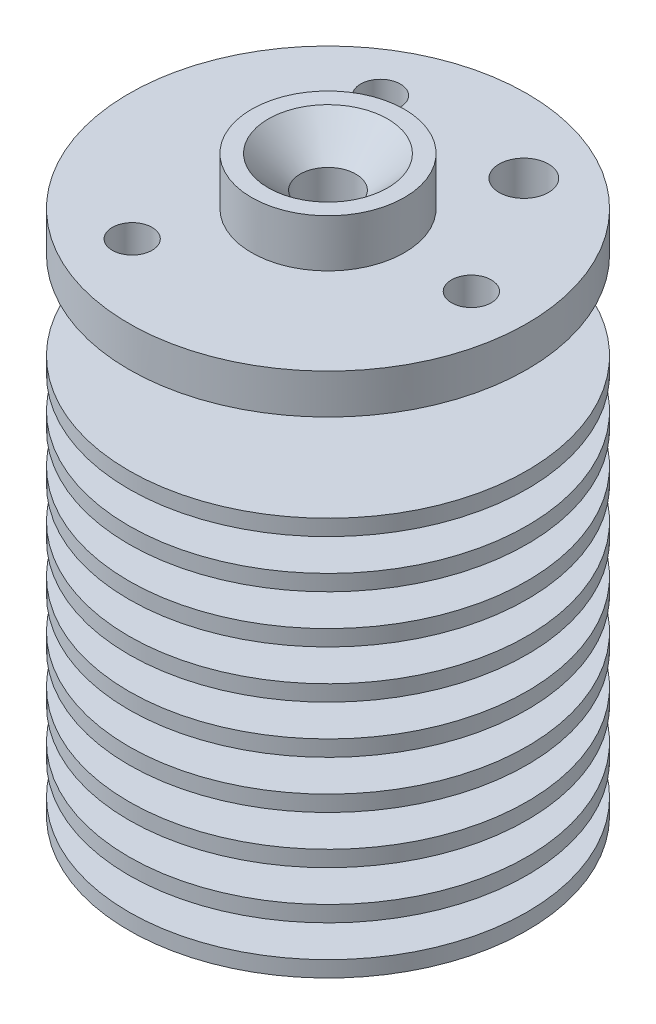
ISO-10303-21;
HEADER;
FILE_DESCRIPTION(('STEP AP214'),'2;1');
FILE_NAME('part.step','',(''),(''),'','','');
FILE_SCHEMA(('AUTOMOTIVE_DESIGN { 1 0 10303 214 1 1 1 1 }'));
ENDSEC;
DATA;
#1=APPLICATION_CONTEXT('core data for automotive mechanical design processes');
#2=APPLICATION_PROTOCOL_DEFINITION('international standard','automotive_design',2000,#1);
#3=PRODUCT_CONTEXT('',#1,'mechanical');
#4=PRODUCT('Part','Part','',(#3));
#5=PRODUCT_RELATED_PRODUCT_CATEGORY('part','',(#4));
#6=PRODUCT_DEFINITION_FORMATION('','',#4);
#7=PRODUCT_DEFINITION_CONTEXT('part definition',#1,'design');
#8=PRODUCT_DEFINITION('design','',#6,#7);
#9=PRODUCT_DEFINITION_SHAPE('','',#8);
#10=(LENGTH_UNIT() NAMED_UNIT(*) SI_UNIT(.MILLI.,.METRE.));
#11=(NAMED_UNIT(*) PLANE_ANGLE_UNIT() SI_UNIT($,.RADIAN.));
#12=(NAMED_UNIT(*) SI_UNIT($,.STERADIAN.) SOLID_ANGLE_UNIT());
#13=UNCERTAINTY_MEASURE_WITH_UNIT(LENGTH_MEASURE(1.E-05),#10,'distance_accuracy_value','');
#14=(GEOMETRIC_REPRESENTATION_CONTEXT(3) GLOBAL_UNCERTAINTY_ASSIGNED_CONTEXT((#13)) GLOBAL_UNIT_ASSIGNED_CONTEXT((#10,
#11,#12)) REPRESENTATION_CONTEXT('',''));
#15=CARTESIAN_POINT('',(0.,0.,0.));
#16=DIRECTION('',(0.,0.,1.));
#17=DIRECTION('',(1.,0.,0.));
#18=AXIS2_PLACEMENT_3D('',#15,#16,#17);
#19=CARTESIAN_POINT('',(0.,9.,-12.5));
#20=DIRECTION('',(0.,-1.,0.));
#21=DIRECTION('',(0.,0.,-1.));
#22=AXIS2_PLACEMENT_3D('',#19,#20,#21);
#23=PLANE('',#22);
#24=CARTESIAN_POINT('',(0.,9.,0.));
#25=DIRECTION('',(0.,1.,0.));
#26=DIRECTION('',(0.,0.,1.));
#27=AXIS2_PLACEMENT_3D('',#24,#25,#26);
#28=CIRCLE('',#27,12.5);
#29=CARTESIAN_POINT('',(0.,9.,12.5));
#30=VERTEX_POINT('',#29);
#31=EDGE_CURVE('E131',#30,#30,#28,.T.);
#32=ORIENTED_EDGE('',*,*,#31,.F.);
#33=EDGE_LOOP('',(#32));
#34=FACE_BOUND('',#33,.T.);
#35=CARTESIAN_POINT('',(0.,9.,0.));
#36=DIRECTION('',(0.,-1.,0.));
#37=DIRECTION('',(0.,0.,-1.));
#38=AXIS2_PLACEMENT_3D('',#35,#36,#37);
#39=CIRCLE('',#38,5.);
#40=CARTESIAN_POINT('',(0.,9.,-5.));
#41=VERTEX_POINT('',#40);
#42=EDGE_CURVE('E192',#41,#41,#39,.T.);
#43=ORIENTED_EDGE('',*,*,#42,.F.);
#44=EDGE_LOOP('',(#43));
#45=FACE_BOUND('',#44,.T.);
#46=ADVANCED_FACE('F36',(#34,#45),#23,.T.);
#47=CARTESIAN_POINT('',(0.,0.999999999999997,-3.5));
#48=DIRECTION('',(0.,1.,0.));
#49=DIRECTION('',(0.,0.,1.));
#50=AXIS2_PLACEMENT_3D('',#47,#48,#49);
#51=PLANE('',#50);
#52=CARTESIAN_POINT('',(0.,0.999999999999994,0.));
#53=DIRECTION('',(0.,1.,0.));
#54=DIRECTION('',(0.,0.,1.));
#55=AXIS2_PLACEMENT_3D('',#52,#53,#54);
#56=CIRCLE('',#55,12.5);
#57=CARTESIAN_POINT('',(0.,0.999999999999994,12.5));
#58=VERTEX_POINT('',#57);
#59=EDGE_CURVE('E146',#58,#58,#56,.T.);
#60=ORIENTED_EDGE('',*,*,#59,.T.);
#61=EDGE_LOOP('',(#60));
#62=FACE_BOUND('',#61,.T.);
#63=CARTESIAN_POINT('',(0.,0.999999999999997,0.));
#64=DIRECTION('',(0.,1.,0.));
#65=DIRECTION('',(0.,0.,1.));
#66=AXIS2_PLACEMENT_3D('',#63,#64,#65);
#67=CIRCLE('',#66,5.);
#68=CARTESIAN_POINT('',(0.,0.999999999999997,5.));
#69=VERTEX_POINT('',#68);
#70=EDGE_CURVE('E191',#69,#69,#67,.T.);
#71=ORIENTED_EDGE('',*,*,#70,.F.);
#72=EDGE_LOOP('',(#71));
#73=FACE_BOUND('',#72,.T.);
#74=ADVANCED_FACE('F239',(#62,#73),#51,.T.);
#75=CARTESIAN_POINT('',(-0.8,33.,0.));
#76=DIRECTION('',(0.,-1.,0.));
#77=DIRECTION('',(0.,0.,-1.));
#78=AXIS2_PLACEMENT_3D('',#75,#76,#77);
#79=PLANE('',#78);
#80=CARTESIAN_POINT('',(4.49999999999998,33.,-7.79422863405996));
#81=DIRECTION('',(0.,1.,0.));
#82=DIRECTION('',(0.,0.,1.));
#83=AXIS2_PLACEMENT_3D('',#80,#81,#82);
#84=CIRCLE('',#83,1.55);
#85=CARTESIAN_POINT('',(4.49999999999998,33.,-6.24422863405996));
#86=VERTEX_POINT('',#85);
#87=EDGE_CURVE('E195',#86,#86,#84,.T.);
#88=ORIENTED_EDGE('',*,*,#87,.F.);
#89=EDGE_LOOP('',(#88));
#90=FACE_BOUND('',#89,.T.);
#91=CARTESIAN_POINT('',(-4.5,33.,-7.79422863405995));
#92=DIRECTION('',(0.,1.,0.));
#93=DIRECTION('',(0.,0.,1.));
#94=AXIS2_PLACEMENT_3D('',#91,#92,#93);
#95=CIRCLE('',#94,1.25);
#96=CARTESIAN_POINT('',(-4.5,33.,-6.54422863405995));
#97=VERTEX_POINT('',#96);
#98=EDGE_CURVE('E173',#97,#97,#95,.T.);
#99=ORIENTED_EDGE('',*,*,#98,.F.);
#100=EDGE_LOOP('',(#99));
#101=FACE_BOUND('',#100,.T.);
#102=CARTESIAN_POINT('',(-4.5,33.,7.79422863405995));
#103=DIRECTION('',(0.,1.,0.));
#104=DIRECTION('',(0.,0.,1.));
#105=AXIS2_PLACEMENT_3D('',#102,#103,#104);
#106=CIRCLE('',#105,1.25);
#107=CARTESIAN_POINT('',(-4.5,33.,9.04422863405995));
#108=VERTEX_POINT('',#107);
#109=EDGE_CURVE('E167',#108,#108,#106,.T.);
#110=ORIENTED_EDGE('',*,*,#109,.F.);
#111=EDGE_LOOP('',(#110));
#112=FACE_BOUND('',#111,.T.);
#113=CARTESIAN_POINT('',(9.,33.,0.));
#114=DIRECTION('',(0.,1.,0.));
#115=DIRECTION('',(0.,0.,1.));
#116=AXIS2_PLACEMENT_3D('',#113,#114,#115);
#117=CIRCLE('',#116,1.25);
#118=CARTESIAN_POINT('',(9.,33.,1.25));
#119=VERTEX_POINT('',#118);
#120=EDGE_CURVE('E161',#119,#119,#117,.T.);
#121=ORIENTED_EDGE('',*,*,#120,.F.);
#122=EDGE_LOOP('',(#121));
#123=FACE_BOUND('',#122,.T.);
#124=CARTESIAN_POINT('',(0.,33.,0.));
#125=DIRECTION('',(0.,-1.,0.));
#126=DIRECTION('',(0.,0.,-1.));
#127=AXIS2_PLACEMENT_3D('',#124,#125,#126);
#128=CIRCLE('',#127,12.5);
#129=CARTESIAN_POINT('',(0.,33.,-12.5));
#130=VERTEX_POINT('',#129);
#131=EDGE_CURVE('E59',#130,#130,#128,.T.);
#132=ORIENTED_EDGE('',*,*,#131,.F.);
#133=EDGE_LOOP('',(#132));
#134=FACE_BOUND('',#133,.T.);
#135=CARTESIAN_POINT('',(0.,33.,0.));
#136=DIRECTION('',(0.,-1.,0.));
#137=DIRECTION('',(0.,0.,-1.));
#138=AXIS2_PLACEMENT_3D('',#135,#136,#137);
#139=CIRCLE('',#138,4.8);
#140=CARTESIAN_POINT('',(0.,33.,-4.8));
#141=VERTEX_POINT('',#140);
#142=EDGE_CURVE('E47',#141,#141,#139,.F.);
#143=ORIENTED_EDGE('',*,*,#142,.F.);
#144=EDGE_LOOP('',(#143));
#145=FACE_BOUND('',#144,.T.);
#146=ADVANCED_FACE('F245',(#90,#101,#112,#123,#134,#145),#79,.F.);
#147=CARTESIAN_POINT('',(0.,0.,0.));
#148=DIRECTION('',(0.,-1.,0.));
#149=DIRECTION('',(0.,0.,-1.));
#150=AXIS2_PLACEMENT_3D('',#147,#148,#149);
#151=CYLINDRICAL_SURFACE('',#150,12.5);
#152=CARTESIAN_POINT('',(0.,0.,0.));
#153=DIRECTION('',(0.,-1.,0.));
#154=DIRECTION('',(0.,0.,-1.));
#155=AXIS2_PLACEMENT_3D('',#152,#153,#154);
#156=CIRCLE('',#155,12.5);
#157=CARTESIAN_POINT('',(0.,0.,-12.5));
#158=VERTEX_POINT('',#157);
#159=EDGE_CURVE('E62',#158,#158,#156,.T.);
#160=ORIENTED_EDGE('',*,*,#159,.F.);
#161=EDGE_LOOP('',(#160));
#162=FACE_BOUND('',#161,.T.);
#163=ORIENTED_EDGE('',*,*,#59,.F.);
#164=EDGE_LOOP('',(#163));
#165=FACE_BOUND('',#164,.T.);
#166=ADVANCED_FACE('F336',(#162,#165),#151,.T.);
#167=CARTESIAN_POINT('',(0.,9.99999999999999,0.));
#168=DIRECTION('',(0.,1.,0.));
#169=DIRECTION('',(0.,0.,1.));
#170=AXIS2_PLACEMENT_3D('',#167,#168,#169);
#171=CIRCLE('',#170,12.5);
#172=CARTESIAN_POINT('',(0.,9.99999999999999,12.5));
#173=VERTEX_POINT('',#172);
#174=EDGE_CURVE('E128',#173,#173,#171,.T.);
#175=ORIENTED_EDGE('',*,*,#174,.F.);
#176=EDGE_LOOP('',(#175));
#177=FACE_BOUND('',#176,.T.);
#178=ORIENTED_EDGE('',*,*,#31,.T.);
#179=EDGE_LOOP('',(#178));
#180=FACE_BOUND('',#179,.T.);
#181=ADVANCED_FACE('F352',(#177,#180),#151,.T.);
#182=CARTESIAN_POINT('',(0.,13.,0.));
#183=DIRECTION('',(0.,1.,0.));
#184=DIRECTION('',(0.,0.,1.));
#185=AXIS2_PLACEMENT_3D('',#182,#183,#184);
#186=CIRCLE('',#185,12.5);
#187=CARTESIAN_POINT('',(0.,13.,12.5));
#188=VERTEX_POINT('',#187);
#189=EDGE_CURVE('E116',#188,#188,#186,.T.);
#190=ORIENTED_EDGE('',*,*,#189,.F.);
#191=EDGE_LOOP('',(#190));
#192=FACE_BOUND('',#191,.T.);
#193=CARTESIAN_POINT('',(0.,12.,0.));
#194=DIRECTION('',(0.,1.,0.));
#195=DIRECTION('',(0.,0.,1.));
#196=AXIS2_PLACEMENT_3D('',#193,#194,#195);
#197=CIRCLE('',#196,12.5);
#198=CARTESIAN_POINT('',(0.,12.,12.5));
#199=VERTEX_POINT('',#198);
#200=EDGE_CURVE('E119',#199,#199,#197,.T.);
#201=ORIENTED_EDGE('',*,*,#200,.T.);
#202=EDGE_LOOP('',(#201));
#203=FACE_BOUND('',#202,.T.);
#204=ADVANCED_FACE('F575',(#192,#203),#151,.T.);
#205=CARTESIAN_POINT('',(0.,16.,0.));
#206=DIRECTION('',(0.,1.,0.));
#207=DIRECTION('',(0.,0.,1.));
#208=AXIS2_PLACEMENT_3D('',#205,#206,#207);
#209=CIRCLE('',#208,12.5);
#210=CARTESIAN_POINT('',(0.,16.,12.5));
#211=VERTEX_POINT('',#210);
#212=EDGE_CURVE('E104',#211,#211,#209,.T.);
#213=ORIENTED_EDGE('',*,*,#212,.F.);
#214=EDGE_LOOP('',(#213));
#215=FACE_BOUND('',#214,.T.);
#216=CARTESIAN_POINT('',(0.,15.,0.));
#217=DIRECTION('',(0.,1.,0.));
#218=DIRECTION('',(0.,0.,1.));
#219=AXIS2_PLACEMENT_3D('',#216,#217,#218);
#220=CIRCLE('',#219,12.5);
#221=CARTESIAN_POINT('',(0.,15.,12.5));
#222=VERTEX_POINT('',#221);
#223=EDGE_CURVE('E107',#222,#222,#220,.T.);
#224=ORIENTED_EDGE('',*,*,#223,.T.);
#225=EDGE_LOOP('',(#224));
#226=FACE_BOUND('',#225,.T.);
#227=ADVANCED_FACE('F582',(#215,#226),#151,.T.);
#228=CARTESIAN_POINT('',(0.,19.,0.));
#229=DIRECTION('',(0.,1.,0.));
#230=DIRECTION('',(0.,0.,1.));
#231=AXIS2_PLACEMENT_3D('',#228,#229,#230);
#232=CIRCLE('',#231,12.5);
#233=CARTESIAN_POINT('',(0.,19.,12.5));
#234=VERTEX_POINT('',#233);
#235=EDGE_CURVE('E92',#234,#234,#232,.T.);
#236=ORIENTED_EDGE('',*,*,#235,.F.);
#237=EDGE_LOOP('',(#236));
#238=FACE_BOUND('',#237,.T.);
#239=CARTESIAN_POINT('',(0.,18.,0.));
#240=DIRECTION('',(0.,1.,0.));
#241=DIRECTION('',(0.,0.,1.));
#242=AXIS2_PLACEMENT_3D('',#239,#240,#241);
#243=CIRCLE('',#242,12.5);
#244=CARTESIAN_POINT('',(0.,18.,12.5));
#245=VERTEX_POINT('',#244);
#246=EDGE_CURVE('E95',#245,#245,#243,.T.);
#247=ORIENTED_EDGE('',*,*,#246,.T.);
#248=EDGE_LOOP('',(#247));
#249=FACE_BOUND('',#248,.T.);
#250=ADVANCED_FACE('F331',(#238,#249),#151,.T.);
#251=CARTESIAN_POINT('',(0.,22.,0.));
#252=DIRECTION('',(0.,1.,0.));
#253=DIRECTION('',(0.,0.,1.));
#254=AXIS2_PLACEMENT_3D('',#251,#252,#253);
#255=CIRCLE('',#254,12.5);
#256=CARTESIAN_POINT('',(0.,22.,12.5));
#257=VERTEX_POINT('',#256);
#258=EDGE_CURVE('E80',#257,#257,#255,.T.);
#259=ORIENTED_EDGE('',*,*,#258,.F.);
#260=EDGE_LOOP('',(#259));
#261=FACE_BOUND('',#260,.T.);
#262=CARTESIAN_POINT('',(0.,21.,0.));
#263=DIRECTION('',(0.,1.,0.));
#264=DIRECTION('',(0.,0.,1.));
#265=AXIS2_PLACEMENT_3D('',#262,#263,#264);
#266=CIRCLE('',#265,12.5);
#267=CARTESIAN_POINT('',(0.,21.,12.5));
#268=VERTEX_POINT('',#267);
#269=EDGE_CURVE('E83',#268,#268,#266,.T.);
#270=ORIENTED_EDGE('',*,*,#269,.T.);
#271=EDGE_LOOP('',(#270));
#272=FACE_BOUND('',#271,.T.);
#273=ADVANCED_FACE('F322',(#261,#272),#151,.T.);
#274=CARTESIAN_POINT('',(0.,25.,0.));
#275=DIRECTION('',(0.,1.,0.));
#276=DIRECTION('',(0.,0.,1.));
#277=AXIS2_PLACEMENT_3D('',#274,#275,#276);
#278=CIRCLE('',#277,12.5);
#279=CARTESIAN_POINT('',(0.,25.,12.5));
#280=VERTEX_POINT('',#279);
#281=EDGE_CURVE('E68',#280,#280,#278,.T.);
#282=ORIENTED_EDGE('',*,*,#281,.F.);
#283=EDGE_LOOP('',(#282));
#284=FACE_BOUND('',#283,.T.);
#285=CARTESIAN_POINT('',(0.,24.,0.));
#286=DIRECTION('',(0.,1.,0.));
#287=DIRECTION('',(0.,0.,1.));
#288=AXIS2_PLACEMENT_3D('',#285,#286,#287);
#289=CIRCLE('',#288,12.5);
#290=CARTESIAN_POINT('',(0.,24.,12.5));
#291=VERTEX_POINT('',#290);
#292=EDGE_CURVE('E71',#291,#291,#289,.T.);
#293=ORIENTED_EDGE('',*,*,#292,.T.);
#294=EDGE_LOOP('',(#293));
#295=FACE_BOUND('',#294,.T.);
#296=ADVANCED_FACE('F319',(#284,#295),#151,.T.);
#297=CARTESIAN_POINT('',(0.,30.5,0.));
#298=DIRECTION('',(0.,1.,0.));
#299=DIRECTION('',(0.,0.,1.));
#300=AXIS2_PLACEMENT_3D('',#297,#298,#299);
#301=CIRCLE('',#300,12.5);
#302=CARTESIAN_POINT('',(0.,30.5,12.5));
#303=VERTEX_POINT('',#302);
#304=EDGE_CURVE('E155',#303,#303,#301,.T.);
#305=ORIENTED_EDGE('',*,*,#304,.T.);
#306=EDGE_LOOP('',(#305));
#307=FACE_BOUND('',#306,.T.);
#308=ORIENTED_EDGE('',*,*,#131,.T.);
#309=EDGE_LOOP('',(#308));
#310=FACE_BOUND('',#309,.T.);
#311=ADVANCED_FACE('F321',(#307,#310),#151,.T.);
#312=CARTESIAN_POINT('',(-12.5,0.,0.));
#313=DIRECTION('',(0.,1.,0.));
#314=DIRECTION('',(0.,0.,1.));
#315=AXIS2_PLACEMENT_3D('',#312,#313,#314);
#316=PLANE('',#315);
#317=ORIENTED_EDGE('',*,*,#159,.T.);
#318=EDGE_LOOP('',(#317));
#319=FACE_BOUND('',#318,.T.);
#320=CARTESIAN_POINT('',(0.,0.,0.));
#321=DIRECTION('',(0.,-1.,0.));
#322=DIRECTION('',(0.,0.,-1.));
#323=AXIS2_PLACEMENT_3D('',#320,#321,#322);
#324=CIRCLE('',#323,2.5);
#325=CARTESIAN_POINT('',(0.,0.,-2.5));
#326=VERTEX_POINT('',#325);
#327=EDGE_CURVE('E51',#326,#326,#324,.T.);
#328=ORIENTED_EDGE('',*,*,#327,.F.);
#329=EDGE_LOOP('',(#328));
#330=FACE_BOUND('',#329,.T.);
#331=ADVANCED_FACE('F328',(#319,#330),#316,.F.);
#332=CARTESIAN_POINT('',(0.,0.,0.));
#333=DIRECTION('',(0.,-1.,0.));
#334=DIRECTION('',(0.,0.,-1.));
#335=AXIS2_PLACEMENT_3D('',#332,#333,#334);
#336=CYLINDRICAL_SURFACE('',#335,2.5);
#337=CARTESIAN_POINT('',(0.,6.,0.));
#338=DIRECTION('',(0.,-1.,0.));
#339=DIRECTION('',(0.,0.,-1.));
#340=AXIS2_PLACEMENT_3D('',#337,#338,#339);
#341=CIRCLE('',#340,2.5);
#342=CARTESIAN_POINT('',(0.,6.,-2.5));
#343=VERTEX_POINT('',#342);
#344=EDGE_CURVE('E56',#343,#343,#341,.T.);
#345=ORIENTED_EDGE('',*,*,#344,.F.);
#346=EDGE_LOOP('',(#345));
#347=FACE_BOUND('',#346,.T.);
#348=ORIENTED_EDGE('',*,*,#327,.T.);
#349=EDGE_LOOP('',(#348));
#350=FACE_BOUND('',#349,.T.);
#351=ADVANCED_FACE('F234',(#347,#350),#336,.F.);
#352=CARTESIAN_POINT('',(-2.5,6.,0.));
#353=DIRECTION('',(0.,1.,0.));
#354=DIRECTION('',(0.,0.,1.));
#355=AXIS2_PLACEMENT_3D('',#352,#353,#354);
#356=PLANE('',#355);
#357=CARTESIAN_POINT('',(0.,6.,0.));
#358=DIRECTION('',(0.,1.,0.));
#359=DIRECTION('',(0.,0.,1.));
#360=AXIS2_PLACEMENT_3D('',#357,#358,#359);
#361=CIRCLE('',#360,1.75);
#362=CARTESIAN_POINT('',(0.,6.,1.75));
#363=VERTEX_POINT('',#362);
#364=EDGE_CURVE('E152',#363,#363,#361,.T.);
#365=ORIENTED_EDGE('',*,*,#364,.T.);
#366=EDGE_LOOP('',(#365));
#367=FACE_BOUND('',#366,.T.);
#368=ORIENTED_EDGE('',*,*,#344,.T.);
#369=EDGE_LOOP('',(#368));
#370=FACE_BOUND('',#369,.T.);
#371=ADVANCED_FACE('F224',(#367,#370),#356,.F.);
#372=CARTESIAN_POINT('',(0.,33.,0.));
#373=DIRECTION('',(0.,1.,0.));
#374=DIRECTION('',(0.,0.,1.));
#375=AXIS2_PLACEMENT_3D('',#372,#373,#374);
#376=CYLINDRICAL_SURFACE('',#375,3.5);
#377=CARTESIAN_POINT('',(0.,25.,0.));
#378=DIRECTION('',(0.,1.,0.));
#379=DIRECTION('',(0.,0.,1.));
#380=AXIS2_PLACEMENT_3D('',#377,#378,#379);
#381=CIRCLE('',#380,3.5);
#382=CARTESIAN_POINT('',(0.,25.,3.5));
#383=VERTEX_POINT('',#382);
#384=EDGE_CURVE('E65',#383,#383,#381,.T.);
#385=ORIENTED_EDGE('',*,*,#384,.T.);
#386=EDGE_LOOP('',(#385));
#387=FACE_BOUND('',#386,.T.);
#388=CARTESIAN_POINT('',(0.,30.5,0.));
#389=DIRECTION('',(0.,1.,0.));
#390=DIRECTION('',(0.,0.,1.));
#391=AXIS2_PLACEMENT_3D('',#388,#389,#390);
#392=CIRCLE('',#391,3.5);
#393=CARTESIAN_POINT('',(0.,30.5,3.5));
#394=VERTEX_POINT('',#393);
#395=EDGE_CURVE('E158',#394,#394,#392,.T.);
#396=ORIENTED_EDGE('',*,*,#395,.F.);
#397=EDGE_LOOP('',(#396));
#398=FACE_BOUND('',#397,.T.);
#399=ADVANCED_FACE('F221',(#387,#398),#376,.T.);
#400=CARTESIAN_POINT('',(0.,25.,-3.5));
#401=DIRECTION('',(0.,1.,0.));
#402=DIRECTION('',(0.,0.,1.));
#403=AXIS2_PLACEMENT_3D('',#400,#401,#402);
#404=PLANE('',#403);
#405=ORIENTED_EDGE('',*,*,#281,.T.);
#406=EDGE_LOOP('',(#405));
#407=FACE_BOUND('',#406,.T.);
#408=ORIENTED_EDGE('',*,*,#384,.F.);
#409=EDGE_LOOP('',(#408));
#410=FACE_BOUND('',#409,.T.);
#411=ADVANCED_FACE('F223',(#407,#410),#404,.T.);
#412=CARTESIAN_POINT('',(0.,24.,-12.5));
#413=DIRECTION('',(0.,-1.,0.));
#414=DIRECTION('',(0.,0.,-1.));
#415=AXIS2_PLACEMENT_3D('',#412,#413,#414);
#416=PLANE('',#415);
#417=CARTESIAN_POINT('',(0.,24.,0.));
#418=DIRECTION('',(0.,1.,0.));
#419=DIRECTION('',(0.,0.,1.));
#420=AXIS2_PLACEMENT_3D('',#417,#418,#419);
#421=CIRCLE('',#420,3.5);
#422=CARTESIAN_POINT('',(0.,24.,3.5));
#423=VERTEX_POINT('',#422);
#424=EDGE_CURVE('E74',#423,#423,#421,.T.);
#425=ORIENTED_EDGE('',*,*,#424,.T.);
#426=EDGE_LOOP('',(#425));
#427=FACE_BOUND('',#426,.T.);
#428=ORIENTED_EDGE('',*,*,#292,.F.);
#429=EDGE_LOOP('',(#428));
#430=FACE_BOUND('',#429,.T.);
#431=ADVANCED_FACE('F231',(#427,#430),#416,.T.);
#432=CARTESIAN_POINT('',(0.,27.,0.));
#433=DIRECTION('',(0.,1.,0.));
#434=DIRECTION('',(0.,0.,1.));
#435=AXIS2_PLACEMENT_3D('',#432,#433,#434);
#436=CYLINDRICAL_SURFACE('',#435,3.5);
#437=CARTESIAN_POINT('',(0.,22.,0.));
#438=DIRECTION('',(0.,1.,0.));
#439=DIRECTION('',(0.,0.,1.));
#440=AXIS2_PLACEMENT_3D('',#437,#438,#439);
#441=CIRCLE('',#440,3.5);
#442=CARTESIAN_POINT('',(0.,22.,3.5));
#443=VERTEX_POINT('',#442);
#444=EDGE_CURVE('E77',#443,#443,#441,.T.);
#445=ORIENTED_EDGE('',*,*,#444,.T.);
#446=EDGE_LOOP('',(#445));
#447=FACE_BOUND('',#446,.T.);
#448=ORIENTED_EDGE('',*,*,#424,.F.);
#449=EDGE_LOOP('',(#448));
#450=FACE_BOUND('',#449,.T.);
#451=ADVANCED_FACE('F306',(#447,#450),#436,.T.);
#452=CARTESIAN_POINT('',(0.,22.,-3.5));
#453=DIRECTION('',(0.,1.,0.));
#454=DIRECTION('',(0.,0.,1.));
#455=AXIS2_PLACEMENT_3D('',#452,#453,#454);
#456=PLANE('',#455);
#457=ORIENTED_EDGE('',*,*,#258,.T.);
#458=EDGE_LOOP('',(#457));
#459=FACE_BOUND('',#458,.T.);
#460=ORIENTED_EDGE('',*,*,#444,.F.);
#461=EDGE_LOOP('',(#460));
#462=FACE_BOUND('',#461,.T.);
#463=ADVANCED_FACE('F302',(#459,#462),#456,.T.);
#464=CARTESIAN_POINT('',(0.,21.,-12.5));
#465=DIRECTION('',(0.,-1.,0.));
#466=DIRECTION('',(0.,0.,-1.));
#467=AXIS2_PLACEMENT_3D('',#464,#465,#466);
#468=PLANE('',#467);
#469=CARTESIAN_POINT('',(0.,21.,0.));
#470=DIRECTION('',(0.,1.,0.));
#471=DIRECTION('',(0.,0.,1.));
#472=AXIS2_PLACEMENT_3D('',#469,#470,#471);
#473=CIRCLE('',#472,3.5);
#474=CARTESIAN_POINT('',(0.,21.,3.5));
#475=VERTEX_POINT('',#474);
#476=EDGE_CURVE('E86',#475,#475,#473,.T.);
#477=ORIENTED_EDGE('',*,*,#476,.T.);
#478=EDGE_LOOP('',(#477));
#479=FACE_BOUND('',#478,.T.);
#480=ORIENTED_EDGE('',*,*,#269,.F.);
#481=EDGE_LOOP('',(#480));
#482=FACE_BOUND('',#481,.T.);
#483=ADVANCED_FACE('F298',(#479,#482),#468,.T.);
#484=CARTESIAN_POINT('',(0.,24.,0.));
#485=DIRECTION('',(0.,1.,0.));
#486=DIRECTION('',(0.,0.,1.));
#487=AXIS2_PLACEMENT_3D('',#484,#485,#486);
#488=CYLINDRICAL_SURFACE('',#487,3.5);
#489=CARTESIAN_POINT('',(0.,19.,0.));
#490=DIRECTION('',(0.,1.,0.));
#491=DIRECTION('',(0.,0.,1.));
#492=AXIS2_PLACEMENT_3D('',#489,#490,#491);
#493=CIRCLE('',#492,3.5);
#494=CARTESIAN_POINT('',(0.,19.,3.5));
#495=VERTEX_POINT('',#494);
#496=EDGE_CURVE('E89',#495,#495,#493,.T.);
#497=ORIENTED_EDGE('',*,*,#496,.T.);
#498=EDGE_LOOP('',(#497));
#499=FACE_BOUND('',#498,.T.);
#500=ORIENTED_EDGE('',*,*,#476,.F.);
#501=EDGE_LOOP('',(#500));
#502=FACE_BOUND('',#501,.T.);
#503=ADVANCED_FACE('F294',(#499,#502),#488,.T.);
#504=CARTESIAN_POINT('',(0.,19.,-3.5));
#505=DIRECTION('',(0.,1.,0.));
#506=DIRECTION('',(0.,0.,1.));
#507=AXIS2_PLACEMENT_3D('',#504,#505,#506);
#508=PLANE('',#507);
#509=ORIENTED_EDGE('',*,*,#235,.T.);
#510=EDGE_LOOP('',(#509));
#511=FACE_BOUND('',#510,.T.);
#512=ORIENTED_EDGE('',*,*,#496,.F.);
#513=EDGE_LOOP('',(#512));
#514=FACE_BOUND('',#513,.T.);
#515=ADVANCED_FACE('F290',(#511,#514),#508,.T.);
#516=CARTESIAN_POINT('',(0.,18.,-12.5));
#517=DIRECTION('',(0.,-1.,0.));
#518=DIRECTION('',(0.,0.,-1.));
#519=AXIS2_PLACEMENT_3D('',#516,#517,#518);
#520=PLANE('',#519);
#521=CARTESIAN_POINT('',(0.,18.,0.));
#522=DIRECTION('',(0.,1.,0.));
#523=DIRECTION('',(0.,0.,1.));
#524=AXIS2_PLACEMENT_3D('',#521,#522,#523);
#525=CIRCLE('',#524,3.5);
#526=CARTESIAN_POINT('',(0.,18.,3.5));
#527=VERTEX_POINT('',#526);
#528=EDGE_CURVE('E98',#527,#527,#525,.T.);
#529=ORIENTED_EDGE('',*,*,#528,.T.);
#530=EDGE_LOOP('',(#529));
#531=FACE_BOUND('',#530,.T.);
#532=ORIENTED_EDGE('',*,*,#246,.F.);
#533=EDGE_LOOP('',(#532));
#534=FACE_BOUND('',#533,.T.);
#535=ADVANCED_FACE('F286',(#531,#534),#520,.T.);
#536=CARTESIAN_POINT('',(0.,21.,0.));
#537=DIRECTION('',(0.,1.,0.));
#538=DIRECTION('',(0.,0.,1.));
#539=AXIS2_PLACEMENT_3D('',#536,#537,#538);
#540=CYLINDRICAL_SURFACE('',#539,3.5);
#541=CARTESIAN_POINT('',(0.,16.,0.));
#542=DIRECTION('',(0.,1.,0.));
#543=DIRECTION('',(0.,0.,1.));
#544=AXIS2_PLACEMENT_3D('',#541,#542,#543);
#545=CIRCLE('',#544,3.5);
#546=CARTESIAN_POINT('',(0.,16.,3.5));
#547=VERTEX_POINT('',#546);
#548=EDGE_CURVE('E101',#547,#547,#545,.T.);
#549=ORIENTED_EDGE('',*,*,#548,.T.);
#550=EDGE_LOOP('',(#549));
#551=FACE_BOUND('',#550,.T.);
#552=ORIENTED_EDGE('',*,*,#528,.F.);
#553=EDGE_LOOP('',(#552));
#554=FACE_BOUND('',#553,.T.);
#555=ADVANCED_FACE('F282',(#551,#554),#540,.T.);
#556=CARTESIAN_POINT('',(0.,16.,-3.5));
#557=DIRECTION('',(0.,1.,0.));
#558=DIRECTION('',(0.,0.,1.));
#559=AXIS2_PLACEMENT_3D('',#556,#557,#558);
#560=PLANE('',#559);
#561=ORIENTED_EDGE('',*,*,#212,.T.);
#562=EDGE_LOOP('',(#561));
#563=FACE_BOUND('',#562,.T.);
#564=ORIENTED_EDGE('',*,*,#548,.F.);
#565=EDGE_LOOP('',(#564));
#566=FACE_BOUND('',#565,.T.);
#567=ADVANCED_FACE('F278',(#563,#566),#560,.T.);
#568=CARTESIAN_POINT('',(0.,15.,-12.5));
#569=DIRECTION('',(0.,-1.,0.));
#570=DIRECTION('',(0.,0.,-1.));
#571=AXIS2_PLACEMENT_3D('',#568,#569,#570);
#572=PLANE('',#571);
#573=CARTESIAN_POINT('',(0.,15.,0.));
#574=DIRECTION('',(0.,1.,0.));
#575=DIRECTION('',(0.,0.,1.));
#576=AXIS2_PLACEMENT_3D('',#573,#574,#575);
#577=CIRCLE('',#576,3.5);
#578=CARTESIAN_POINT('',(0.,15.,3.5));
#579=VERTEX_POINT('',#578);
#580=EDGE_CURVE('E110',#579,#579,#577,.T.);
#581=ORIENTED_EDGE('',*,*,#580,.T.);
#582=EDGE_LOOP('',(#581));
#583=FACE_BOUND('',#582,.T.);
#584=ORIENTED_EDGE('',*,*,#223,.F.);
#585=EDGE_LOOP('',(#584));
#586=FACE_BOUND('',#585,.T.);
#587=ADVANCED_FACE('F274',(#583,#586),#572,.T.);
#588=CARTESIAN_POINT('',(0.,18.,0.));
#589=DIRECTION('',(0.,1.,0.));
#590=DIRECTION('',(0.,0.,1.));
#591=AXIS2_PLACEMENT_3D('',#588,#589,#590);
#592=CYLINDRICAL_SURFACE('',#591,3.5);
#593=CARTESIAN_POINT('',(0.,13.,0.));
#594=DIRECTION('',(0.,1.,0.));
#595=DIRECTION('',(0.,0.,1.));
#596=AXIS2_PLACEMENT_3D('',#593,#594,#595);
#597=CIRCLE('',#596,3.5);
#598=CARTESIAN_POINT('',(0.,13.,3.5));
#599=VERTEX_POINT('',#598);
#600=EDGE_CURVE('E113',#599,#599,#597,.T.);
#601=ORIENTED_EDGE('',*,*,#600,.T.);
#602=EDGE_LOOP('',(#601));
#603=FACE_BOUND('',#602,.T.);
#604=ORIENTED_EDGE('',*,*,#580,.F.);
#605=EDGE_LOOP('',(#604));
#606=FACE_BOUND('',#605,.T.);
#607=ADVANCED_FACE('F270',(#603,#606),#592,.T.);
#608=CARTESIAN_POINT('',(0.,13.,-3.5));
#609=DIRECTION('',(0.,1.,0.));
#610=DIRECTION('',(0.,0.,1.));
#611=AXIS2_PLACEMENT_3D('',#608,#609,#610);
#612=PLANE('',#611);
#613=ORIENTED_EDGE('',*,*,#189,.T.);
#614=EDGE_LOOP('',(#613));
#615=FACE_BOUND('',#614,.T.);
#616=ORIENTED_EDGE('',*,*,#600,.F.);
#617=EDGE_LOOP('',(#616));
#618=FACE_BOUND('',#617,.T.);
#619=ADVANCED_FACE('F266',(#615,#618),#612,.T.);
#620=CARTESIAN_POINT('',(0.,12.,-12.5));
#621=DIRECTION('',(0.,-1.,0.));
#622=DIRECTION('',(0.,0.,-1.));
#623=AXIS2_PLACEMENT_3D('',#620,#621,#622);
#624=PLANE('',#623);
#625=CARTESIAN_POINT('',(0.,12.,0.));
#626=DIRECTION('',(0.,1.,0.));
#627=DIRECTION('',(0.,0.,1.));
#628=AXIS2_PLACEMENT_3D('',#625,#626,#627);
#629=CIRCLE('',#628,3.5);
#630=CARTESIAN_POINT('',(0.,12.,3.5));
#631=VERTEX_POINT('',#630);
#632=EDGE_CURVE('E122',#631,#631,#629,.T.);
#633=ORIENTED_EDGE('',*,*,#632,.T.);
#634=EDGE_LOOP('',(#633));
#635=FACE_BOUND('',#634,.T.);
#636=ORIENTED_EDGE('',*,*,#200,.F.);
#637=EDGE_LOOP('',(#636));
#638=FACE_BOUND('',#637,.T.);
#639=ADVANCED_FACE('F262',(#635,#638),#624,.T.);
#640=CARTESIAN_POINT('',(0.,15.,0.));
#641=DIRECTION('',(0.,1.,0.));
#642=DIRECTION('',(0.,0.,1.));
#643=AXIS2_PLACEMENT_3D('',#640,#641,#642);
#644=CYLINDRICAL_SURFACE('',#643,3.5);
#645=CARTESIAN_POINT('',(0.,9.99999999999999,0.));
#646=DIRECTION('',(0.,1.,0.));
#647=DIRECTION('',(0.,0.,1.));
#648=AXIS2_PLACEMENT_3D('',#645,#646,#647);
#649=CIRCLE('',#648,3.5);
#650=CARTESIAN_POINT('',(0.,9.99999999999999,3.5));
#651=VERTEX_POINT('',#650);
#652=EDGE_CURVE('E125',#651,#651,#649,.T.);
#653=ORIENTED_EDGE('',*,*,#652,.T.);
#654=EDGE_LOOP('',(#653));
#655=FACE_BOUND('',#654,.T.);
#656=ORIENTED_EDGE('',*,*,#632,.F.);
#657=EDGE_LOOP('',(#656));
#658=FACE_BOUND('',#657,.T.);
#659=ADVANCED_FACE('F258',(#655,#658),#644,.T.);
#660=CARTESIAN_POINT('',(0.,9.99999999999999,-3.5));
#661=DIRECTION('',(0.,1.,0.));
#662=DIRECTION('',(0.,0.,1.));
#663=AXIS2_PLACEMENT_3D('',#660,#661,#662);
#664=PLANE('',#663);
#665=ORIENTED_EDGE('',*,*,#174,.T.);
#666=EDGE_LOOP('',(#665));
#667=FACE_BOUND('',#666,.T.);
#668=ORIENTED_EDGE('',*,*,#652,.F.);
#669=EDGE_LOOP('',(#668));
#670=FACE_BOUND('',#669,.T.);
#671=ADVANCED_FACE('F254',(#667,#670),#664,.T.);
#672=CARTESIAN_POINT('',(0.,36.,0.));
#673=DIRECTION('',(0.,1.,0.));
#674=DIRECTION('',(0.,0.,1.));
#675=AXIS2_PLACEMENT_3D('',#672,#673,#674);
#676=PLANE('',#675);
#677=CARTESIAN_POINT('',(0.,36.,0.));
#678=DIRECTION('',(0.,1.,0.));
#679=DIRECTION('',(0.,0.,1.));
#680=AXIS2_PLACEMENT_3D('',#677,#678,#679);
#681=CIRCLE('',#680,3.75000000000001);
#682=CARTESIAN_POINT('',(0.,36.,3.75000000000001));
#683=VERTEX_POINT('',#682);
#684=EDGE_CURVE('E10',#683,#683,#681,.F.);
#685=ORIENTED_EDGE('',*,*,#684,.T.);
#686=EDGE_LOOP('',(#685));
#687=FACE_BOUND('',#686,.T.);
#688=CARTESIAN_POINT('',(0.,36.,0.));
#689=DIRECTION('',(0.,1.,0.));
#690=DIRECTION('',(0.,0.,1.));
#691=AXIS2_PLACEMENT_3D('',#688,#689,#690);
#692=CIRCLE('',#691,4.8);
#693=CARTESIAN_POINT('',(0.,36.,4.8));
#694=VERTEX_POINT('',#693);
#695=EDGE_CURVE('E149',#694,#694,#692,.T.);
#696=ORIENTED_EDGE('',*,*,#695,.T.);
#697=EDGE_LOOP('',(#696));
#698=FACE_BOUND('',#697,.T.);
#699=ADVANCED_FACE('F257',(#687,#698),#676,.T.);
#700=CARTESIAN_POINT('',(0.,36.,0.));
#701=DIRECTION('',(0.,-1.,0.));
#702=DIRECTION('',(0.,0.,-1.));
#703=AXIS2_PLACEMENT_3D('',#700,#701,#702);
#704=CYLINDRICAL_SURFACE('',#703,4.8);
#705=ORIENTED_EDGE('',*,*,#695,.F.);
#706=EDGE_LOOP('',(#705));
#707=FACE_BOUND('',#706,.T.);
#708=ORIENTED_EDGE('',*,*,#142,.T.);
#709=EDGE_LOOP('',(#708));
#710=FACE_BOUND('',#709,.T.);
#711=ADVANCED_FACE('F403',(#707,#710),#704,.T.);
#712=CARTESIAN_POINT('',(0.,0.,0.));
#713=DIRECTION('',(0.,1.,0.));
#714=DIRECTION('',(0.,0.,1.));
#715=AXIS2_PLACEMENT_3D('',#712,#713,#714);
#716=CYLINDRICAL_SURFACE('',#715,1.75);
#717=CARTESIAN_POINT('',(0.,34.,0.));
#718=DIRECTION('',(0.,1.,0.));
#719=DIRECTION('',(0.,0.,1.));
#720=AXIS2_PLACEMENT_3D('',#717,#718,#719);
#721=CIRCLE('',#720,1.75);
#722=CARTESIAN_POINT('',(0.,34.,1.75));
#723=VERTEX_POINT('',#722);
#724=EDGE_CURVE('E43',#723,#723,#721,.T.);
#725=ORIENTED_EDGE('',*,*,#724,.T.);
#726=EDGE_LOOP('',(#725));
#727=FACE_BOUND('',#726,.T.);
#728=ORIENTED_EDGE('',*,*,#364,.F.);
#729=EDGE_LOOP('',(#728));
#730=FACE_BOUND('',#729,.T.);
#731=ADVANCED_FACE('F406',(#727,#730),#716,.F.);
#732=CARTESIAN_POINT('',(0.,34.,0.));
#733=DIRECTION('',(0.,1.,0.));
#734=DIRECTION('',(0.,0.,1.));
#735=AXIS2_PLACEMENT_3D('',#732,#733,#734);
#736=CONICAL_SURFACE('',#735,1.75,0.78539816339745);
#737=ORIENTED_EDGE('',*,*,#684,.F.);
#738=EDGE_LOOP('',(#737));
#739=FACE_BOUND('',#738,.T.);
#740=ORIENTED_EDGE('',*,*,#724,.F.);
#741=EDGE_LOOP('',(#740));
#742=FACE_BOUND('',#741,.T.);
#743=ADVANCED_FACE('F38',(#739,#742),#736,.F.);
#744=CARTESIAN_POINT('',(0.,30.5,0.));
#745=DIRECTION('',(0.,1.,0.));
#746=DIRECTION('',(0.,0.,1.));
#747=AXIS2_PLACEMENT_3D('',#744,#745,#746);
#748=PLANE('',#747);
#749=CARTESIAN_POINT('',(4.49999999999998,30.5,-7.79422863405996));
#750=DIRECTION('',(0.,1.,0.));
#751=DIRECTION('',(0.,0.,1.));
#752=AXIS2_PLACEMENT_3D('',#749,#750,#751);
#753=CIRCLE('',#752,1.55);
#754=CARTESIAN_POINT('',(4.49999999999998,30.5,-6.24422863405996));
#755=VERTEX_POINT('',#754);
#756=EDGE_CURVE('E200',#755,#755,#753,.F.);
#757=ORIENTED_EDGE('',*,*,#756,.F.);
#758=EDGE_LOOP('',(#757));
#759=FACE_BOUND('',#758,.T.);
#760=CARTESIAN_POINT('',(-4.5,30.5,-7.79422863405995));
#761=DIRECTION('',(0.,1.,0.));
#762=DIRECTION('',(0.,0.,1.));
#763=AXIS2_PLACEMENT_3D('',#760,#761,#762);
#764=CIRCLE('',#763,1.25);
#765=CARTESIAN_POINT('',(-4.5,30.5,-6.54422863405995));
#766=VERTEX_POINT('',#765);
#767=EDGE_CURVE('E176',#766,#766,#764,.F.);
#768=ORIENTED_EDGE('',*,*,#767,.F.);
#769=EDGE_LOOP('',(#768));
#770=FACE_BOUND('',#769,.T.);
#771=CARTESIAN_POINT('',(-4.5,30.5,7.79422863405995));
#772=DIRECTION('',(0.,1.,0.));
#773=DIRECTION('',(0.,0.,1.));
#774=AXIS2_PLACEMENT_3D('',#771,#772,#773);
#775=CIRCLE('',#774,1.25);
#776=CARTESIAN_POINT('',(-4.5,30.5,9.04422863405995));
#777=VERTEX_POINT('',#776);
#778=EDGE_CURVE('E170',#777,#777,#775,.F.);
#779=ORIENTED_EDGE('',*,*,#778,.F.);
#780=EDGE_LOOP('',(#779));
#781=FACE_BOUND('',#780,.T.);
#782=CARTESIAN_POINT('',(9.,30.5,0.));
#783=DIRECTION('',(0.,1.,0.));
#784=DIRECTION('',(0.,0.,1.));
#785=AXIS2_PLACEMENT_3D('',#782,#783,#784);
#786=CIRCLE('',#785,1.25);
#787=CARTESIAN_POINT('',(9.,30.5,1.25));
#788=VERTEX_POINT('',#787);
#789=EDGE_CURVE('E164',#788,#788,#786,.F.);
#790=ORIENTED_EDGE('',*,*,#789,.F.);
#791=EDGE_LOOP('',(#790));
#792=FACE_BOUND('',#791,.T.);
#793=ORIENTED_EDGE('',*,*,#304,.F.);
#794=EDGE_LOOP('',(#793));
#795=FACE_BOUND('',#794,.T.);
#796=ORIENTED_EDGE('',*,*,#395,.T.);
#797=EDGE_LOOP('',(#796));
#798=FACE_BOUND('',#797,.T.);
#799=ADVANCED_FACE('F206',(#759,#770,#781,#792,#795,#798),#748,.F.);
#800=CARTESIAN_POINT('',(9.,-0.001000000000001,0.));
#801=DIRECTION('',(0.,1.,0.));
#802=DIRECTION('',(0.,0.,1.));
#803=AXIS2_PLACEMENT_3D('',#800,#801,#802);
#804=CYLINDRICAL_SURFACE('',#803,1.25);
#805=ORIENTED_EDGE('',*,*,#120,.T.);
#806=EDGE_LOOP('',(#805));
#807=FACE_BOUND('',#806,.T.);
#808=ORIENTED_EDGE('',*,*,#789,.T.);
#809=EDGE_LOOP('',(#808));
#810=FACE_BOUND('',#809,.T.);
#811=ADVANCED_FACE('F209',(#807,#810),#804,.F.);
#812=CARTESIAN_POINT('',(-4.5,-0.001000000000001,7.79422863405995));
#813=DIRECTION('',(0.,1.,0.));
#814=DIRECTION('',(0.,0.,1.));
#815=AXIS2_PLACEMENT_3D('',#812,#813,#814);
#816=CYLINDRICAL_SURFACE('',#815,1.25);
#817=ORIENTED_EDGE('',*,*,#109,.T.);
#818=EDGE_LOOP('',(#817));
#819=FACE_BOUND('',#818,.T.);
#820=ORIENTED_EDGE('',*,*,#778,.T.);
#821=EDGE_LOOP('',(#820));
#822=FACE_BOUND('',#821,.T.);
#823=ADVANCED_FACE('F372',(#819,#822),#816,.F.);
#824=CARTESIAN_POINT('',(-4.5,-0.001000000000001,-7.79422863405995));
#825=DIRECTION('',(0.,1.,0.));
#826=DIRECTION('',(0.,0.,1.));
#827=AXIS2_PLACEMENT_3D('',#824,#825,#826);
#828=CYLINDRICAL_SURFACE('',#827,1.25);
#829=ORIENTED_EDGE('',*,*,#98,.T.);
#830=EDGE_LOOP('',(#829));
#831=FACE_BOUND('',#830,.T.);
#832=ORIENTED_EDGE('',*,*,#767,.T.);
#833=EDGE_LOOP('',(#832));
#834=FACE_BOUND('',#833,.T.);
#835=ADVANCED_FACE('F361',(#831,#834),#828,.F.);
#836=CARTESIAN_POINT('',(0.,23.1421356237309,0.));
#837=DIRECTION('',(0.,-1.,0.));
#838=DIRECTION('',(0.,0.,-1.));
#839=AXIS2_PLACEMENT_3D('',#836,#837,#838);
#840=CYLINDRICAL_SURFACE('',#839,5.);
#841=CARTESIAN_POINT('',(0.,3.,0.));
#842=DIRECTION('',(0.,-1.,0.));
#843=DIRECTION('',(0.,0.,-1.));
#844=AXIS2_PLACEMENT_3D('',#841,#842,#843);
#845=CIRCLE('',#844,5.);
#846=CARTESIAN_POINT('',(0.,3.,-5.));
#847=VERTEX_POINT('',#846);
#848=EDGE_CURVE('E188',#847,#847,#845,.F.);
#849=ORIENTED_EDGE('',*,*,#848,.F.);
#850=EDGE_LOOP('',(#849));
#851=FACE_BOUND('',#850,.T.);
#852=ORIENTED_EDGE('',*,*,#70,.T.);
#853=EDGE_LOOP('',(#852));
#854=FACE_BOUND('',#853,.T.);
#855=ADVANCED_FACE('F358',(#851,#854),#840,.T.);
#856=CARTESIAN_POINT('',(0.,4.,-3.5));
#857=DIRECTION('',(0.,1.,0.));
#858=DIRECTION('',(0.,0.,1.));
#859=AXIS2_PLACEMENT_3D('',#856,#857,#858);
#860=PLANE('',#859);
#861=CARTESIAN_POINT('',(0.,3.99999999999999,0.));
#862=DIRECTION('',(0.,1.,0.));
#863=DIRECTION('',(0.,0.,1.));
#864=AXIS2_PLACEMENT_3D('',#861,#862,#863);
#865=CIRCLE('',#864,12.5);
#866=CARTESIAN_POINT('',(0.,3.99999999999999,12.5));
#867=VERTEX_POINT('',#866);
#868=EDGE_CURVE('E140',#867,#867,#865,.T.);
#869=ORIENTED_EDGE('',*,*,#868,.T.);
#870=EDGE_LOOP('',(#869));
#871=FACE_BOUND('',#870,.T.);
#872=CARTESIAN_POINT('',(0.,4.,0.));
#873=DIRECTION('',(0.,1.,0.));
#874=DIRECTION('',(0.,0.,1.));
#875=AXIS2_PLACEMENT_3D('',#872,#873,#874);
#876=CIRCLE('',#875,5.);
#877=CARTESIAN_POINT('',(0.,4.,5.));
#878=VERTEX_POINT('',#877);
#879=EDGE_CURVE('E185',#878,#878,#876,.F.);
#880=ORIENTED_EDGE('',*,*,#879,.T.);
#881=EDGE_LOOP('',(#880));
#882=FACE_BOUND('',#881,.T.);
#883=ADVANCED_FACE('F360',(#871,#882),#860,.T.);
#884=ORIENTED_EDGE('',*,*,#868,.F.);
#885=EDGE_LOOP('',(#884));
#886=FACE_BOUND('',#885,.T.);
#887=CARTESIAN_POINT('',(0.,3.,0.));
#888=DIRECTION('',(0.,1.,0.));
#889=DIRECTION('',(0.,0.,1.));
#890=AXIS2_PLACEMENT_3D('',#887,#888,#889);
#891=CIRCLE('',#890,12.5);
#892=CARTESIAN_POINT('',(0.,3.,12.5));
#893=VERTEX_POINT('',#892);
#894=EDGE_CURVE('E143',#893,#893,#891,.T.);
#895=ORIENTED_EDGE('',*,*,#894,.T.);
#896=EDGE_LOOP('',(#895));
#897=FACE_BOUND('',#896,.T.);
#898=ADVANCED_FACE('F330',(#886,#897),#151,.T.);
#899=CARTESIAN_POINT('',(0.,3.,-12.5));
#900=DIRECTION('',(0.,-1.,0.));
#901=DIRECTION('',(0.,0.,-1.));
#902=AXIS2_PLACEMENT_3D('',#899,#900,#901);
#903=PLANE('',#902);
#904=ORIENTED_EDGE('',*,*,#894,.F.);
#905=EDGE_LOOP('',(#904));
#906=FACE_BOUND('',#905,.T.);
#907=ORIENTED_EDGE('',*,*,#848,.T.);
#908=EDGE_LOOP('',(#907));
#909=FACE_BOUND('',#908,.T.);
#910=ADVANCED_FACE('F381',(#906,#909),#903,.T.);
#911=CARTESIAN_POINT('',(0.,6.,0.));
#912=DIRECTION('',(0.,-1.,0.));
#913=DIRECTION('',(0.,0.,-1.));
#914=AXIS2_PLACEMENT_3D('',#911,#912,#913);
#915=CIRCLE('',#914,5.);
#916=CARTESIAN_POINT('',(0.,6.,-5.));
#917=VERTEX_POINT('',#916);
#918=EDGE_CURVE('E182',#917,#917,#915,.F.);
#919=ORIENTED_EDGE('',*,*,#918,.F.);
#920=EDGE_LOOP('',(#919));
#921=FACE_BOUND('',#920,.T.);
#922=ORIENTED_EDGE('',*,*,#879,.F.);
#923=EDGE_LOOP('',(#922));
#924=FACE_BOUND('',#923,.T.);
#925=ADVANCED_FACE('F365',(#921,#924),#840,.T.);
#926=CARTESIAN_POINT('',(0.,7.,-3.5));
#927=DIRECTION('',(0.,1.,0.));
#928=DIRECTION('',(0.,0.,1.));
#929=AXIS2_PLACEMENT_3D('',#926,#927,#928);
#930=PLANE('',#929);
#931=CARTESIAN_POINT('',(0.,6.99999999999999,0.));
#932=DIRECTION('',(0.,1.,0.));
#933=DIRECTION('',(0.,0.,1.));
#934=AXIS2_PLACEMENT_3D('',#931,#932,#933);
#935=CIRCLE('',#934,12.5);
#936=CARTESIAN_POINT('',(0.,6.99999999999999,12.5));
#937=VERTEX_POINT('',#936);
#938=EDGE_CURVE('E134',#937,#937,#935,.T.);
#939=ORIENTED_EDGE('',*,*,#938,.T.);
#940=EDGE_LOOP('',(#939));
#941=FACE_BOUND('',#940,.T.);
#942=CARTESIAN_POINT('',(0.,7.,0.));
#943=DIRECTION('',(0.,1.,0.));
#944=DIRECTION('',(0.,0.,1.));
#945=AXIS2_PLACEMENT_3D('',#942,#943,#944);
#946=CIRCLE('',#945,5.);
#947=CARTESIAN_POINT('',(0.,7.,5.));
#948=VERTEX_POINT('',#947);
#949=EDGE_CURVE('E179',#948,#948,#946,.F.);
#950=ORIENTED_EDGE('',*,*,#949,.T.);
#951=EDGE_LOOP('',(#950));
#952=FACE_BOUND('',#951,.T.);
#953=ADVANCED_FACE('F252',(#941,#952),#930,.T.);
#954=ORIENTED_EDGE('',*,*,#938,.F.);
#955=EDGE_LOOP('',(#954));
#956=FACE_BOUND('',#955,.T.);
#957=CARTESIAN_POINT('',(0.,6.,0.));
#958=DIRECTION('',(0.,1.,0.));
#959=DIRECTION('',(0.,0.,1.));
#960=AXIS2_PLACEMENT_3D('',#957,#958,#959);
#961=CIRCLE('',#960,12.5);
#962=CARTESIAN_POINT('',(0.,6.,12.5));
#963=VERTEX_POINT('',#962);
#964=EDGE_CURVE('E137',#963,#963,#961,.T.);
#965=ORIENTED_EDGE('',*,*,#964,.T.);
#966=EDGE_LOOP('',(#965));
#967=FACE_BOUND('',#966,.T.);
#968=ADVANCED_FACE('F353',(#956,#967),#151,.T.);
#969=CARTESIAN_POINT('',(0.,6.,-12.5));
#970=DIRECTION('',(0.,-1.,0.));
#971=DIRECTION('',(0.,0.,-1.));
#972=AXIS2_PLACEMENT_3D('',#969,#970,#971);
#973=PLANE('',#972);
#974=ORIENTED_EDGE('',*,*,#964,.F.);
#975=EDGE_LOOP('',(#974));
#976=FACE_BOUND('',#975,.T.);
#977=ORIENTED_EDGE('',*,*,#918,.T.);
#978=EDGE_LOOP('',(#977));
#979=FACE_BOUND('',#978,.T.);
#980=ADVANCED_FACE('F378',(#976,#979),#973,.T.);
#981=ORIENTED_EDGE('',*,*,#949,.F.);
#982=EDGE_LOOP('',(#981));
#983=FACE_BOUND('',#982,.T.);
#984=ORIENTED_EDGE('',*,*,#42,.T.);
#985=EDGE_LOOP('',(#984));
#986=FACE_BOUND('',#985,.T.);
#987=ADVANCED_FACE('F364',(#983,#986),#840,.T.);
#988=CARTESIAN_POINT('',(4.49999999999998,-0.001000000000001,-7.79422863405996));
#989=DIRECTION('',(0.,1.,0.));
#990=DIRECTION('',(0.,0.,1.));
#991=AXIS2_PLACEMENT_3D('',#988,#989,#990);
#992=CYLINDRICAL_SURFACE('',#991,1.55);
#993=ORIENTED_EDGE('',*,*,#87,.T.);
#994=EDGE_LOOP('',(#993));
#995=FACE_BOUND('',#994,.T.);
#996=ORIENTED_EDGE('',*,*,#756,.T.);
#997=EDGE_LOOP('',(#996));
#998=FACE_BOUND('',#997,.T.);
#999=ADVANCED_FACE('F204',(#995,#998),#992,.F.);
#1000=CLOSED_SHELL('',(#46,#74,#146,#166,#181,#204,#227,#250,#273,#296,#311,#331,#351,#371,#399,
#411,#431,#451,#463,#483,#503,#515,#535,#555,#567,#587,#607,#619,#639,#659,#671,#699,#711,#731,
#743,#799,#811,#823,#835,#855,#883,#898,#910,#925,#953,#968,#980,#987,#999));
#1001=MANIFOLD_SOLID_BREP('B2',#1000);
#1002=ADVANCED_BREP_SHAPE_REPRESENTATION('',(#18,#1001),#14);
#1003=SHAPE_DEFINITION_REPRESENTATION(#9,#1002);
ENDSEC;
END-ISO-10303-21;
